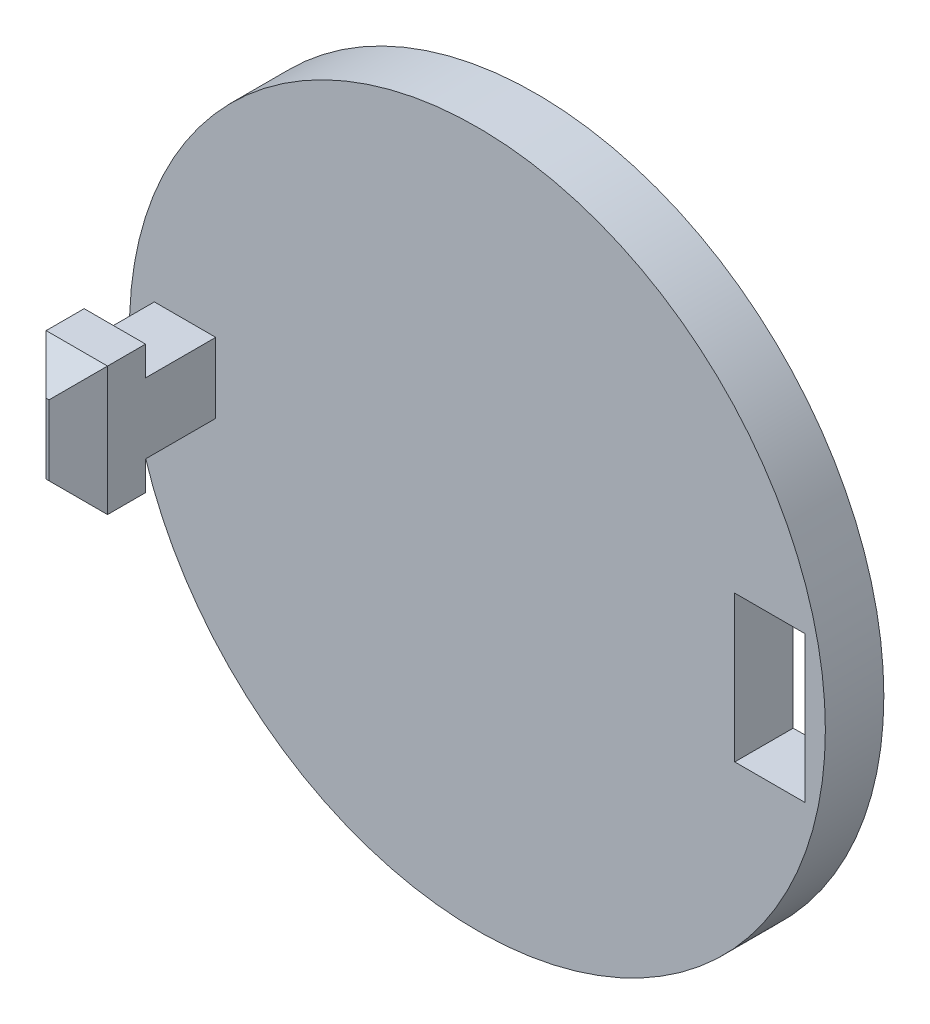
ISO-10303-21;
HEADER;
FILE_DESCRIPTION(('STEP AP214'),'2;1');
FILE_NAME('part.step','',(''),(''),'','','');
FILE_SCHEMA(('AUTOMOTIVE_DESIGN { 1 0 10303 214 1 1 1 1 }'));
ENDSEC;
DATA;
#1=APPLICATION_CONTEXT('core data for automotive mechanical design processes');
#2=APPLICATION_PROTOCOL_DEFINITION('international standard','automotive_design',2000,#1);
#3=PRODUCT_CONTEXT('',#1,'mechanical');
#4=PRODUCT('Part','Part','',(#3));
#5=PRODUCT_RELATED_PRODUCT_CATEGORY('part','',(#4));
#6=PRODUCT_DEFINITION_FORMATION('','',#4);
#7=PRODUCT_DEFINITION_CONTEXT('part definition',#1,'design');
#8=PRODUCT_DEFINITION('design','',#6,#7);
#9=PRODUCT_DEFINITION_SHAPE('','',#8);
#10=(LENGTH_UNIT() NAMED_UNIT(*) SI_UNIT(.MILLI.,.METRE.));
#11=(NAMED_UNIT(*) PLANE_ANGLE_UNIT() SI_UNIT($,.RADIAN.));
#12=(NAMED_UNIT(*) SI_UNIT($,.STERADIAN.) SOLID_ANGLE_UNIT());
#13=UNCERTAINTY_MEASURE_WITH_UNIT(LENGTH_MEASURE(1.E-05),#10,'distance_accuracy_value','');
#14=(GEOMETRIC_REPRESENTATION_CONTEXT(3) GLOBAL_UNCERTAINTY_ASSIGNED_CONTEXT((#13)) GLOBAL_UNIT_ASSIGNED_CONTEXT((#10,
#11,#12)) REPRESENTATION_CONTEXT('',''));
#15=CARTESIAN_POINT('',(0.,0.,0.));
#16=DIRECTION('',(0.,0.,1.));
#17=DIRECTION('',(1.,0.,0.));
#18=AXIS2_PLACEMENT_3D('',#15,#16,#17);
#19=CARTESIAN_POINT('',(-11.05,-1.2,6.7));
#20=DIRECTION('',(0.,1.,0.));
#21=DIRECTION('',(0.,0.,1.));
#22=AXIS2_PLACEMENT_3D('',#19,#20,#21);
#23=PLANE('',#22);
#24=DIRECTION('',(1.,0.,0.));
#25=VECTOR('',#24,1.);
#26=CARTESIAN_POINT('',(-11.05,-1.2,4.4));
#27=LINE('',#26,#25);
#28=CARTESIAN_POINT('',(-11.05,-1.2,4.4));
#29=VERTEX_POINT('',#28);
#30=CARTESIAN_POINT('',(-8.95,-1.2,4.4));
#31=VERTEX_POINT('',#30);
#32=EDGE_CURVE('E147',#29,#31,#27,.T.);
#33=ORIENTED_EDGE('',*,*,#32,.F.);
#34=DIRECTION('',(0.,0.,-1.));
#35=VECTOR('',#34,1.);
#36=CARTESIAN_POINT('',(-11.05,-1.2,6.7));
#37=LINE('',#36,#35);
#38=CARTESIAN_POINT('',(-11.05,-1.2,2.));
#39=VERTEX_POINT('',#38);
#40=EDGE_CURVE('E161',#29,#39,#37,.T.);
#41=ORIENTED_EDGE('',*,*,#40,.T.);
#42=DIRECTION('',(1.,0.,0.));
#43=VECTOR('',#42,1.);
#44=CARTESIAN_POINT('',(-11.05,-1.2,2.));
#45=LINE('',#44,#43);
#46=CARTESIAN_POINT('',(-8.95,-1.2,2.));
#47=VERTEX_POINT('',#46);
#48=EDGE_CURVE('E187',#39,#47,#45,.T.);
#49=ORIENTED_EDGE('',*,*,#48,.T.);
#50=DIRECTION('',(0.,0.,-1.));
#51=VECTOR('',#50,1.);
#52=CARTESIAN_POINT('',(-8.95,-1.2,6.7));
#53=LINE('',#52,#51);
#54=EDGE_CURVE('E190',#31,#47,#53,.T.);
#55=ORIENTED_EDGE('',*,*,#54,.F.);
#56=EDGE_LOOP('',(#33,#41,#49,#55));
#57=FACE_BOUND('',#56,.T.);
#58=ADVANCED_FACE('F36',(#57),#23,.F.);
#59=CARTESIAN_POINT('',(-11.05,1.2,6.7));
#60=DIRECTION('',(0.,-1.,0.));
#61=DIRECTION('',(1.,0.,0.));
#62=AXIS2_PLACEMENT_3D('',#59,#60,#61);
#63=PLANE('',#62);
#64=DIRECTION('',(-1.,0.,0.));
#65=VECTOR('',#64,1.);
#66=CARTESIAN_POINT('',(-8.95,1.2,4.4));
#67=LINE('',#66,#65);
#68=CARTESIAN_POINT('',(-8.95,1.2,4.4));
#69=VERTEX_POINT('',#68);
#70=CARTESIAN_POINT('',(-11.05,1.2,4.4));
#71=VERTEX_POINT('',#70);
#72=EDGE_CURVE('E162',#69,#71,#67,.T.);
#73=ORIENTED_EDGE('',*,*,#72,.F.);
#74=DIRECTION('',(0.,0.,-1.));
#75=VECTOR('',#74,1.);
#76=CARTESIAN_POINT('',(-8.95,1.2,6.7));
#77=LINE('',#76,#75);
#78=CARTESIAN_POINT('',(-8.95,1.2,2.));
#79=VERTEX_POINT('',#78);
#80=EDGE_CURVE('E195',#69,#79,#77,.T.);
#81=ORIENTED_EDGE('',*,*,#80,.T.);
#82=DIRECTION('',(-1.,0.,0.));
#83=VECTOR('',#82,1.);
#84=CARTESIAN_POINT('',(-11.05,1.2,2.));
#85=LINE('',#84,#83);
#86=CARTESIAN_POINT('',(-11.05,1.2,2.));
#87=VERTEX_POINT('',#86);
#88=EDGE_CURVE('E182',#79,#87,#85,.T.);
#89=ORIENTED_EDGE('',*,*,#88,.T.);
#90=DIRECTION('',(0.,0.,-1.));
#91=VECTOR('',#90,1.);
#92=CARTESIAN_POINT('',(-11.05,1.2,6.7));
#93=LINE('',#92,#91);
#94=EDGE_CURVE('E193',#71,#87,#93,.T.);
#95=ORIENTED_EDGE('',*,*,#94,.F.);
#96=EDGE_LOOP('',(#73,#81,#89,#95));
#97=FACE_BOUND('',#96,.T.);
#98=ADVANCED_FACE('F276',(#97),#63,.F.);
#99=CARTESIAN_POINT('',(0.,0.,2.));
#100=DIRECTION('',(0.,0.,1.));
#101=DIRECTION('',(1.,0.,0.));
#102=AXIS2_PLACEMENT_3D('',#99,#100,#101);
#103=PLANE('',#102);
#104=CARTESIAN_POINT('',(0.,0.,2.));
#105=DIRECTION('',(0.,0.,1.));
#106=DIRECTION('',(1.,0.,0.));
#107=AXIS2_PLACEMENT_3D('',#104,#105,#106);
#108=CIRCLE('',#107,11.9);
#109=CARTESIAN_POINT('',(11.9,0.,2.));
#110=VERTEX_POINT('',#109);
#111=EDGE_CURVE('E229',#110,#110,#108,.T.);
#112=ORIENTED_EDGE('',*,*,#111,.T.);
#113=EDGE_LOOP('',(#112));
#114=FACE_BOUND('',#113,.T.);
#115=DIRECTION('',(-1.,0.,0.));
#116=VECTOR('',#115,1.);
#117=CARTESIAN_POINT('',(8.8,2.5,2.));
#118=LINE('',#117,#116);
#119=CARTESIAN_POINT('',(11.2,2.5,2.));
#120=VERTEX_POINT('',#119);
#121=CARTESIAN_POINT('',(8.8,2.5,2.));
#122=VERTEX_POINT('',#121);
#123=EDGE_CURVE('E200',#120,#122,#118,.T.);
#124=ORIENTED_EDGE('',*,*,#123,.F.);
#125=DIRECTION('',(0.,1.,0.));
#126=VECTOR('',#125,1.);
#127=CARTESIAN_POINT('',(11.2,2.5,2.));
#128=LINE('',#127,#126);
#129=CARTESIAN_POINT('',(11.2,-2.5,2.));
#130=VERTEX_POINT('',#129);
#131=EDGE_CURVE('E198',#130,#120,#128,.T.);
#132=ORIENTED_EDGE('',*,*,#131,.F.);
#133=DIRECTION('',(1.,0.,0.));
#134=VECTOR('',#133,1.);
#135=CARTESIAN_POINT('',(8.8,-2.5,2.));
#136=LINE('',#135,#134);
#137=CARTESIAN_POINT('',(8.8,-2.5,2.));
#138=VERTEX_POINT('',#137);
#139=EDGE_CURVE('E206',#138,#130,#136,.T.);
#140=ORIENTED_EDGE('',*,*,#139,.F.);
#141=DIRECTION('',(0.,-1.,0.));
#142=VECTOR('',#141,1.);
#143=CARTESIAN_POINT('',(8.8,2.5,2.));
#144=LINE('',#143,#142);
#145=EDGE_CURVE('E203',#122,#138,#144,.T.);
#146=ORIENTED_EDGE('',*,*,#145,.F.);
#147=EDGE_LOOP('',(#124,#132,#140,#146));
#148=FACE_BOUND('',#147,.T.);
#149=ORIENTED_EDGE('',*,*,#88,.F.);
#150=DIRECTION('',(0.,1.,0.));
#151=VECTOR('',#150,1.);
#152=CARTESIAN_POINT('',(-8.95,1.2,2.));
#153=LINE('',#152,#151);
#154=EDGE_CURVE('E179',#47,#79,#153,.T.);
#155=ORIENTED_EDGE('',*,*,#154,.F.);
#156=ORIENTED_EDGE('',*,*,#48,.F.);
#157=DIRECTION('',(0.,-1.,0.));
#158=VECTOR('',#157,1.);
#159=CARTESIAN_POINT('',(-11.05,1.2,2.));
#160=LINE('',#159,#158);
#161=EDGE_CURVE('E185',#87,#39,#160,.T.);
#162=ORIENTED_EDGE('',*,*,#161,.F.);
#163=EDGE_LOOP('',(#149,#155,#156,#162));
#164=FACE_BOUND('',#163,.T.);
#165=ADVANCED_FACE('F282',(#114,#148,#164),#103,.T.);
#166=CARTESIAN_POINT('',(0.,0.,0.));
#167=DIRECTION('',(0.,0.,1.));
#168=DIRECTION('',(1.,0.,0.));
#169=AXIS2_PLACEMENT_3D('',#166,#167,#168);
#170=PLANE('',#169);
#171=CARTESIAN_POINT('',(0.,0.,0.));
#172=DIRECTION('',(0.,0.,1.));
#173=DIRECTION('',(1.,0.,0.));
#174=AXIS2_PLACEMENT_3D('',#171,#172,#173);
#175=CIRCLE('',#174,11.9);
#176=CARTESIAN_POINT('',(11.9,0.,0.));
#177=VERTEX_POINT('',#176);
#178=EDGE_CURVE('E228',#177,#177,#175,.T.);
#179=ORIENTED_EDGE('',*,*,#178,.F.);
#180=EDGE_LOOP('',(#179));
#181=FACE_BOUND('',#180,.T.);
#182=DIRECTION('',(0.,1.,0.));
#183=VECTOR('',#182,1.);
#184=CARTESIAN_POINT('',(11.2,2.5,0.));
#185=LINE('',#184,#183);
#186=CARTESIAN_POINT('',(11.2,-2.5,0.));
#187=VERTEX_POINT('',#186);
#188=CARTESIAN_POINT('',(11.2,2.5,0.));
#189=VERTEX_POINT('',#188);
#190=EDGE_CURVE('E197',#187,#189,#185,.T.);
#191=ORIENTED_EDGE('',*,*,#190,.T.);
#192=DIRECTION('',(-1.,0.,0.));
#193=VECTOR('',#192,1.);
#194=CARTESIAN_POINT('',(8.8,2.5,0.));
#195=LINE('',#194,#193);
#196=CARTESIAN_POINT('',(8.8,2.5,0.));
#197=VERTEX_POINT('',#196);
#198=EDGE_CURVE('E211',#189,#197,#195,.T.);
#199=ORIENTED_EDGE('',*,*,#198,.T.);
#200=DIRECTION('',(0.,-1.,0.));
#201=VECTOR('',#200,1.);
#202=CARTESIAN_POINT('',(8.8,2.5,0.));
#203=LINE('',#202,#201);
#204=CARTESIAN_POINT('',(8.8,-2.5,0.));
#205=VERTEX_POINT('',#204);
#206=EDGE_CURVE('E214',#197,#205,#203,.T.);
#207=ORIENTED_EDGE('',*,*,#206,.T.);
#208=DIRECTION('',(1.,0.,0.));
#209=VECTOR('',#208,1.);
#210=CARTESIAN_POINT('',(8.8,-2.5,0.));
#211=LINE('',#210,#209);
#212=EDGE_CURVE('E201',#205,#187,#211,.T.);
#213=ORIENTED_EDGE('',*,*,#212,.T.);
#214=EDGE_LOOP('',(#191,#199,#207,#213));
#215=FACE_BOUND('',#214,.T.);
#216=ADVANCED_FACE('F313',(#181,#215),#170,.F.);
#217=CARTESIAN_POINT('',(0.,0.,2.));
#218=DIRECTION('',(0.,0.,-1.));
#219=DIRECTION('',(-1.,0.,0.));
#220=AXIS2_PLACEMENT_3D('',#217,#218,#219);
#221=CYLINDRICAL_SURFACE('',#220,11.9);
#222=ORIENTED_EDGE('',*,*,#111,.F.);
#223=EDGE_LOOP('',(#222));
#224=FACE_BOUND('',#223,.T.);
#225=ORIENTED_EDGE('',*,*,#178,.T.);
#226=EDGE_LOOP('',(#225));
#227=FACE_BOUND('',#226,.T.);
#228=ADVANCED_FACE('F309',(#224,#227),#221,.T.);
#229=CARTESIAN_POINT('',(11.2,2.5,2.));
#230=DIRECTION('',(-1.,0.,0.));
#231=DIRECTION('',(0.,-1.,0.));
#232=AXIS2_PLACEMENT_3D('',#229,#230,#231);
#233=PLANE('',#232);
#234=ORIENTED_EDGE('',*,*,#190,.F.);
#235=DIRECTION('',(0.,0.,-1.));
#236=VECTOR('',#235,1.);
#237=CARTESIAN_POINT('',(11.2,-2.5,2.));
#238=LINE('',#237,#236);
#239=EDGE_CURVE('E208',#130,#187,#238,.T.);
#240=ORIENTED_EDGE('',*,*,#239,.F.);
#241=ORIENTED_EDGE('',*,*,#131,.T.);
#242=DIRECTION('',(0.,0.,-1.));
#243=VECTOR('',#242,1.);
#244=CARTESIAN_POINT('',(11.2,2.5,2.));
#245=LINE('',#244,#243);
#246=EDGE_CURVE('E225',#120,#189,#245,.T.);
#247=ORIENTED_EDGE('',*,*,#246,.T.);
#248=EDGE_LOOP('',(#234,#240,#241,#247));
#249=FACE_BOUND('',#248,.T.);
#250=ADVANCED_FACE('F305',(#249),#233,.T.);
#251=CARTESIAN_POINT('',(8.8,2.5,2.));
#252=DIRECTION('',(0.,-1.,0.));
#253=DIRECTION('',(0.,0.,-1.));
#254=AXIS2_PLACEMENT_3D('',#251,#252,#253);
#255=PLANE('',#254);
#256=ORIENTED_EDGE('',*,*,#198,.F.);
#257=ORIENTED_EDGE('',*,*,#246,.F.);
#258=ORIENTED_EDGE('',*,*,#123,.T.);
#259=DIRECTION('',(0.,0.,-1.));
#260=VECTOR('',#259,1.);
#261=CARTESIAN_POINT('',(8.8,2.5,2.));
#262=LINE('',#261,#260);
#263=EDGE_CURVE('E223',#122,#197,#262,.T.);
#264=ORIENTED_EDGE('',*,*,#263,.T.);
#265=EDGE_LOOP('',(#256,#257,#258,#264));
#266=FACE_BOUND('',#265,.T.);
#267=ADVANCED_FACE('F301',(#266),#255,.T.);
#268=CARTESIAN_POINT('',(8.8,2.5,2.));
#269=DIRECTION('',(1.,0.,0.));
#270=DIRECTION('',(0.,0.,-1.));
#271=AXIS2_PLACEMENT_3D('',#268,#269,#270);
#272=PLANE('',#271);
#273=ORIENTED_EDGE('',*,*,#206,.F.);
#274=ORIENTED_EDGE('',*,*,#263,.F.);
#275=ORIENTED_EDGE('',*,*,#145,.T.);
#276=DIRECTION('',(0.,0.,-1.));
#277=VECTOR('',#276,1.);
#278=CARTESIAN_POINT('',(8.8,-2.5,2.));
#279=LINE('',#278,#277);
#280=EDGE_CURVE('E221',#138,#205,#279,.T.);
#281=ORIENTED_EDGE('',*,*,#280,.T.);
#282=EDGE_LOOP('',(#273,#274,#275,#281));
#283=FACE_BOUND('',#282,.T.);
#284=ADVANCED_FACE('F297',(#283),#272,.T.);
#285=CARTESIAN_POINT('',(8.8,-2.5,2.));
#286=DIRECTION('',(0.,1.,0.));
#287=DIRECTION('',(0.,0.,1.));
#288=AXIS2_PLACEMENT_3D('',#285,#286,#287);
#289=PLANE('',#288);
#290=ORIENTED_EDGE('',*,*,#212,.F.);
#291=ORIENTED_EDGE('',*,*,#280,.F.);
#292=ORIENTED_EDGE('',*,*,#139,.T.);
#293=ORIENTED_EDGE('',*,*,#239,.T.);
#294=EDGE_LOOP('',(#290,#291,#292,#293));
#295=FACE_BOUND('',#294,.T.);
#296=ADVANCED_FACE('F294',(#295),#289,.T.);
#297=CARTESIAN_POINT('',(-8.95,1.2,6.7));
#298=DIRECTION('',(-1.,0.,0.));
#299=DIRECTION('',(0.,0.,1.));
#300=AXIS2_PLACEMENT_3D('',#297,#298,#299);
#301=PLANE('',#300);
#302=DIRECTION('',(0.,0.,-1.));
#303=VECTOR('',#302,1.);
#304=CARTESIAN_POINT('',(-8.95,2.2,6.7));
#305=LINE('',#304,#303);
#306=CARTESIAN_POINT('',(-8.95,2.2,5.7));
#307=VERTEX_POINT('',#306);
#308=CARTESIAN_POINT('',(-8.95,2.2,4.4));
#309=VERTEX_POINT('',#308);
#310=EDGE_CURVE('E164',#307,#309,#305,.T.);
#311=ORIENTED_EDGE('',*,*,#310,.F.);
#312=DIRECTION('',(0.,-1.,0.));
#313=VECTOR('',#312,1.);
#314=CARTESIAN_POINT('',(-8.95,-2.2,5.7));
#315=LINE('',#314,#313);
#316=CARTESIAN_POINT('',(-8.95,-2.2,5.7));
#317=VERTEX_POINT('',#316);
#318=EDGE_CURVE('E11',#307,#317,#315,.T.);
#319=ORIENTED_EDGE('',*,*,#318,.T.);
#320=DIRECTION('',(0.,0.,1.));
#321=VECTOR('',#320,1.);
#322=CARTESIAN_POINT('',(-8.95,-2.2,6.7));
#323=LINE('',#322,#321);
#324=CARTESIAN_POINT('',(-8.95,-2.2,4.4));
#325=VERTEX_POINT('',#324);
#326=EDGE_CURVE('E156',#325,#317,#323,.T.);
#327=ORIENTED_EDGE('',*,*,#326,.F.);
#328=DIRECTION('',(0.,1.,0.));
#329=VECTOR('',#328,1.);
#330=CARTESIAN_POINT('',(-8.95,-2.2,4.4));
#331=LINE('',#330,#329);
#332=EDGE_CURVE('E154',#325,#31,#331,.T.);
#333=ORIENTED_EDGE('',*,*,#332,.T.);
#334=ORIENTED_EDGE('',*,*,#54,.T.);
#335=ORIENTED_EDGE('',*,*,#154,.T.);
#336=ORIENTED_EDGE('',*,*,#80,.F.);
#337=DIRECTION('',(0.,-1.,0.));
#338=VECTOR('',#337,1.);
#339=CARTESIAN_POINT('',(-8.95,2.2,4.4));
#340=LINE('',#339,#338);
#341=EDGE_CURVE('E177',#309,#69,#340,.T.);
#342=ORIENTED_EDGE('',*,*,#341,.F.);
#343=EDGE_LOOP('',(#311,#319,#327,#333,#334,#335,#336,#342));
#344=FACE_BOUND('',#343,.T.);
#345=ADVANCED_FACE('F290',(#344),#301,.F.);
#346=CARTESIAN_POINT('',(-11.05,1.2,6.7));
#347=DIRECTION('',(1.,0.,0.));
#348=DIRECTION('',(0.,0.,-1.));
#349=AXIS2_PLACEMENT_3D('',#346,#347,#348);
#350=PLANE('',#349);
#351=DIRECTION('',(0.,0.,-1.));
#352=VECTOR('',#351,1.);
#353=CARTESIAN_POINT('',(-11.05,-2.2,6.7));
#354=LINE('',#353,#352);
#355=CARTESIAN_POINT('',(-11.05,-2.2,5.7));
#356=VERTEX_POINT('',#355);
#357=CARTESIAN_POINT('',(-11.05,-2.2,4.4));
#358=VERTEX_POINT('',#357);
#359=EDGE_CURVE('E138',#356,#358,#354,.T.);
#360=ORIENTED_EDGE('',*,*,#359,.F.);
#361=DIRECTION('',(0.,1.,0.));
#362=VECTOR('',#361,1.);
#363=CARTESIAN_POINT('',(-11.05,2.2,5.7));
#364=LINE('',#363,#362);
#365=CARTESIAN_POINT('',(-11.05,2.2,5.7));
#366=VERTEX_POINT('',#365);
#367=EDGE_CURVE('E60',#356,#366,#364,.T.);
#368=ORIENTED_EDGE('',*,*,#367,.T.);
#369=DIRECTION('',(0.,0.,1.));
#370=VECTOR('',#369,1.);
#371=CARTESIAN_POINT('',(-11.05,2.2,6.7));
#372=LINE('',#371,#370);
#373=CARTESIAN_POINT('',(-11.05,2.2,4.4));
#374=VERTEX_POINT('',#373);
#375=EDGE_CURVE('E172',#374,#366,#372,.T.);
#376=ORIENTED_EDGE('',*,*,#375,.F.);
#377=DIRECTION('',(0.,-1.,0.));
#378=VECTOR('',#377,1.);
#379=CARTESIAN_POINT('',(-11.05,2.2,4.4));
#380=LINE('',#379,#378);
#381=EDGE_CURVE('E173',#374,#71,#380,.T.);
#382=ORIENTED_EDGE('',*,*,#381,.T.);
#383=ORIENTED_EDGE('',*,*,#94,.T.);
#384=ORIENTED_EDGE('',*,*,#161,.T.);
#385=ORIENTED_EDGE('',*,*,#40,.F.);
#386=DIRECTION('',(0.,1.,0.));
#387=VECTOR('',#386,1.);
#388=CARTESIAN_POINT('',(-11.05,-2.2,4.4));
#389=LINE('',#388,#387);
#390=EDGE_CURVE('E151',#358,#29,#389,.T.);
#391=ORIENTED_EDGE('',*,*,#390,.F.);
#392=EDGE_LOOP('',(#360,#368,#376,#382,#383,#384,#385,#391));
#393=FACE_BOUND('',#392,.T.);
#394=ADVANCED_FACE('F159',(#393),#350,.F.);
#395=CARTESIAN_POINT('',(0.,0.,6.7));
#396=DIRECTION('',(0.,0.,1.));
#397=DIRECTION('',(1.,0.,0.));
#398=AXIS2_PLACEMENT_3D('',#395,#396,#397);
#399=PLANE('',#398);
#400=DIRECTION('',(0.,-1.,0.));
#401=VECTOR('',#400,1.);
#402=CARTESIAN_POINT('',(-10.05,-2.2,6.7));
#403=LINE('',#402,#401);
#404=CARTESIAN_POINT('',(-10.05,1.2,6.7));
#405=VERTEX_POINT('',#404);
#406=CARTESIAN_POINT('',(-10.05,-1.2,6.7));
#407=VERTEX_POINT('',#406);
#408=EDGE_CURVE('E239',#405,#407,#403,.T.);
#409=ORIENTED_EDGE('',*,*,#408,.T.);
#410=DIRECTION('',(1.,0.,0.));
#411=VECTOR('',#410,1.);
#412=CARTESIAN_POINT('',(0.,-1.2,6.7));
#413=LINE('',#412,#411);
#414=CARTESIAN_POINT('',(-9.95,-1.2,6.7));
#415=VERTEX_POINT('',#414);
#416=EDGE_CURVE('E241',#407,#415,#413,.T.);
#417=ORIENTED_EDGE('',*,*,#416,.T.);
#418=DIRECTION('',(0.,1.,0.));
#419=VECTOR('',#418,1.);
#420=CARTESIAN_POINT('',(-9.95,2.2,6.7));
#421=LINE('',#420,#419);
#422=CARTESIAN_POINT('',(-9.95,1.2,6.7));
#423=VERTEX_POINT('',#422);
#424=EDGE_CURVE('E235',#415,#423,#421,.T.);
#425=ORIENTED_EDGE('',*,*,#424,.T.);
#426=DIRECTION('',(-1.,0.,0.));
#427=VECTOR('',#426,1.);
#428=CARTESIAN_POINT('',(0.,1.2,6.7));
#429=LINE('',#428,#427);
#430=EDGE_CURVE('E237',#423,#405,#429,.T.);
#431=ORIENTED_EDGE('',*,*,#430,.T.);
#432=EDGE_LOOP('',(#409,#417,#425,#431));
#433=FACE_BOUND('',#432,.T.);
#434=ADVANCED_FACE('F287',(#433),#399,.T.);
#435=CARTESIAN_POINT('',(-8.95,2.2,4.4));
#436=DIRECTION('',(0.,0.,1.));
#437=DIRECTION('',(1.,0.,0.));
#438=AXIS2_PLACEMENT_3D('',#435,#436,#437);
#439=PLANE('',#438);
#440=ORIENTED_EDGE('',*,*,#72,.T.);
#441=ORIENTED_EDGE('',*,*,#381,.F.);
#442=DIRECTION('',(-1.,0.,0.));
#443=VECTOR('',#442,1.);
#444=CARTESIAN_POINT('',(-8.95,2.2,4.4));
#445=LINE('',#444,#443);
#446=EDGE_CURVE('E170',#309,#374,#445,.T.);
#447=ORIENTED_EDGE('',*,*,#446,.F.);
#448=ORIENTED_EDGE('',*,*,#341,.T.);
#449=EDGE_LOOP('',(#440,#441,#447,#448));
#450=FACE_BOUND('',#449,.T.);
#451=ADVANCED_FACE('F349',(#450),#439,.F.);
#452=CARTESIAN_POINT('',(0.,2.2,0.));
#453=DIRECTION('',(0.,1.,0.));
#454=DIRECTION('',(-1.,0.,0.));
#455=AXIS2_PLACEMENT_3D('',#452,#453,#454);
#456=PLANE('',#455);
#457=ORIENTED_EDGE('',*,*,#375,.T.);
#458=DIRECTION('',(1.,0.,0.));
#459=VECTOR('',#458,1.);
#460=CARTESIAN_POINT('',(0.,2.2,5.7));
#461=LINE('',#460,#459);
#462=EDGE_CURVE('E45',#366,#307,#461,.T.);
#463=ORIENTED_EDGE('',*,*,#462,.T.);
#464=ORIENTED_EDGE('',*,*,#310,.T.);
#465=ORIENTED_EDGE('',*,*,#446,.T.);
#466=EDGE_LOOP('',(#457,#463,#464,#465));
#467=FACE_BOUND('',#466,.T.);
#468=ADVANCED_FACE('F357',(#467),#456,.T.);
#469=CARTESIAN_POINT('',(-11.05,-2.2,4.4));
#470=DIRECTION('',(0.,0.,1.));
#471=DIRECTION('',(1.,0.,0.));
#472=AXIS2_PLACEMENT_3D('',#469,#470,#471);
#473=PLANE('',#472);
#474=ORIENTED_EDGE('',*,*,#32,.T.);
#475=ORIENTED_EDGE('',*,*,#332,.F.);
#476=DIRECTION('',(1.,0.,0.));
#477=VECTOR('',#476,1.);
#478=CARTESIAN_POINT('',(-11.05,-2.2,4.4));
#479=LINE('',#478,#477);
#480=EDGE_CURVE('E142',#358,#325,#479,.T.);
#481=ORIENTED_EDGE('',*,*,#480,.F.);
#482=ORIENTED_EDGE('',*,*,#390,.T.);
#483=EDGE_LOOP('',(#474,#475,#481,#482));
#484=FACE_BOUND('',#483,.T.);
#485=ADVANCED_FACE('F150',(#484),#473,.F.);
#486=CARTESIAN_POINT('',(0.,-2.2,0.));
#487=DIRECTION('',(0.,-1.,0.));
#488=DIRECTION('',(0.,0.,-1.));
#489=AXIS2_PLACEMENT_3D('',#486,#487,#488);
#490=PLANE('',#489);
#491=ORIENTED_EDGE('',*,*,#326,.T.);
#492=DIRECTION('',(-1.,0.,0.));
#493=VECTOR('',#492,1.);
#494=CARTESIAN_POINT('',(0.,-2.2,5.7));
#495=LINE('',#494,#493);
#496=EDGE_CURVE('E145',#317,#356,#495,.T.);
#497=ORIENTED_EDGE('',*,*,#496,.T.);
#498=ORIENTED_EDGE('',*,*,#359,.T.);
#499=ORIENTED_EDGE('',*,*,#480,.T.);
#500=EDGE_LOOP('',(#491,#497,#498,#499));
#501=FACE_BOUND('',#500,.T.);
#502=ADVANCED_FACE('F141',(#501),#490,.T.);
#503=CARTESIAN_POINT('',(0.,2.2,5.7));
#504=DIRECTION('',(0.,-0.707106781186549,-0.707106781186546));
#505=DIRECTION('',(1.,0.,0.));
#506=AXIS2_PLACEMENT_3D('',#503,#504,#505);
#507=PLANE('',#506);
#508=DIRECTION('',(-0.577350269189625,0.577350269189625,-0.577350269189627));
#509=VECTOR('',#508,1.);
#510=CARTESIAN_POINT('',(-7.36666666666668,-1.48333333333333,9.38333333333334));
#511=LINE('',#510,#509);
#512=EDGE_CURVE('E249',#405,#366,#511,.T.);
#513=ORIENTED_EDGE('',*,*,#512,.F.);
#514=ORIENTED_EDGE('',*,*,#430,.F.);
#515=DIRECTION('',(0.577350269189625,0.577350269189625,-0.577350269189627));
#516=VECTOR('',#515,1.);
#517=CARTESIAN_POINT('',(-10.35,0.800000000000001,7.1));
#518=LINE('',#517,#516);
#519=EDGE_CURVE('E40',#307,#423,#518,.F.);
#520=ORIENTED_EDGE('',*,*,#519,.F.);
#521=ORIENTED_EDGE('',*,*,#462,.F.);
#522=EDGE_LOOP('',(#513,#514,#520,#521));
#523=FACE_BOUND('',#522,.T.);
#524=ADVANCED_FACE('F38',(#523),#507,.F.);
#525=CARTESIAN_POINT('',(-9.95,0.,6.7));
#526=DIRECTION('',(0.707106781186549,0.,0.707106781186546));
#527=DIRECTION('',(0.,-1.,0.));
#528=AXIS2_PLACEMENT_3D('',#525,#526,#527);
#529=PLANE('',#528);
#530=ORIENTED_EDGE('',*,*,#519,.T.);
#531=ORIENTED_EDGE('',*,*,#424,.F.);
#532=DIRECTION('',(-0.577350269189625,0.577350269189625,0.577350269189627));
#533=VECTOR('',#532,1.);
#534=CARTESIAN_POINT('',(-10.35,-0.800000000000004,7.1));
#535=LINE('',#534,#533);
#536=EDGE_CURVE('E248',#317,#415,#535,.T.);
#537=ORIENTED_EDGE('',*,*,#536,.F.);
#538=ORIENTED_EDGE('',*,*,#318,.F.);
#539=EDGE_LOOP('',(#530,#531,#537,#538));
#540=FACE_BOUND('',#539,.T.);
#541=ADVANCED_FACE('F262',(#540),#529,.T.);
#542=CARTESIAN_POINT('',(-10.05,0.,6.7));
#543=DIRECTION('',(-0.707106781186549,0.,0.707106781186546));
#544=DIRECTION('',(0.,1.,0.));
#545=AXIS2_PLACEMENT_3D('',#542,#543,#544);
#546=PLANE('',#545);
#547=ORIENTED_EDGE('',*,*,#512,.T.);
#548=ORIENTED_EDGE('',*,*,#367,.F.);
#549=DIRECTION('',(-0.577350269189625,-0.577350269189625,-0.577350269189627));
#550=VECTOR('',#549,1.);
#551=CARTESIAN_POINT('',(-9.65,-0.800000000000004,7.1));
#552=LINE('',#551,#550);
#553=EDGE_CURVE('E246',#407,#356,#552,.T.);
#554=ORIENTED_EDGE('',*,*,#553,.F.);
#555=ORIENTED_EDGE('',*,*,#408,.F.);
#556=EDGE_LOOP('',(#547,#548,#554,#555));
#557=FACE_BOUND('',#556,.T.);
#558=ADVANCED_FACE('F267',(#557),#546,.T.);
#559=CARTESIAN_POINT('',(0.,-2.2,5.7));
#560=DIRECTION('',(0.,0.707106781186549,-0.707106781186546));
#561=DIRECTION('',(-1.,0.,0.));
#562=AXIS2_PLACEMENT_3D('',#559,#560,#561);
#563=PLANE('',#562);
#564=ORIENTED_EDGE('',*,*,#536,.T.);
#565=ORIENTED_EDGE('',*,*,#416,.F.);
#566=ORIENTED_EDGE('',*,*,#553,.T.);
#567=ORIENTED_EDGE('',*,*,#496,.F.);
#568=EDGE_LOOP('',(#564,#565,#566,#567));
#569=FACE_BOUND('',#568,.T.);
#570=ADVANCED_FACE('F265',(#569),#563,.F.);
#571=CLOSED_SHELL('',(#58,#98,#165,#216,#228,#250,#267,#284,#296,#345,#394,#434,#451,#468,#485,
#502,#524,#541,#558,#570));
#572=MANIFOLD_SOLID_BREP('B2',#571);
#573=ADVANCED_BREP_SHAPE_REPRESENTATION('',(#18,#572),#14);
#574=SHAPE_DEFINITION_REPRESENTATION(#9,#573);
ENDSEC;
END-ISO-10303-21;
